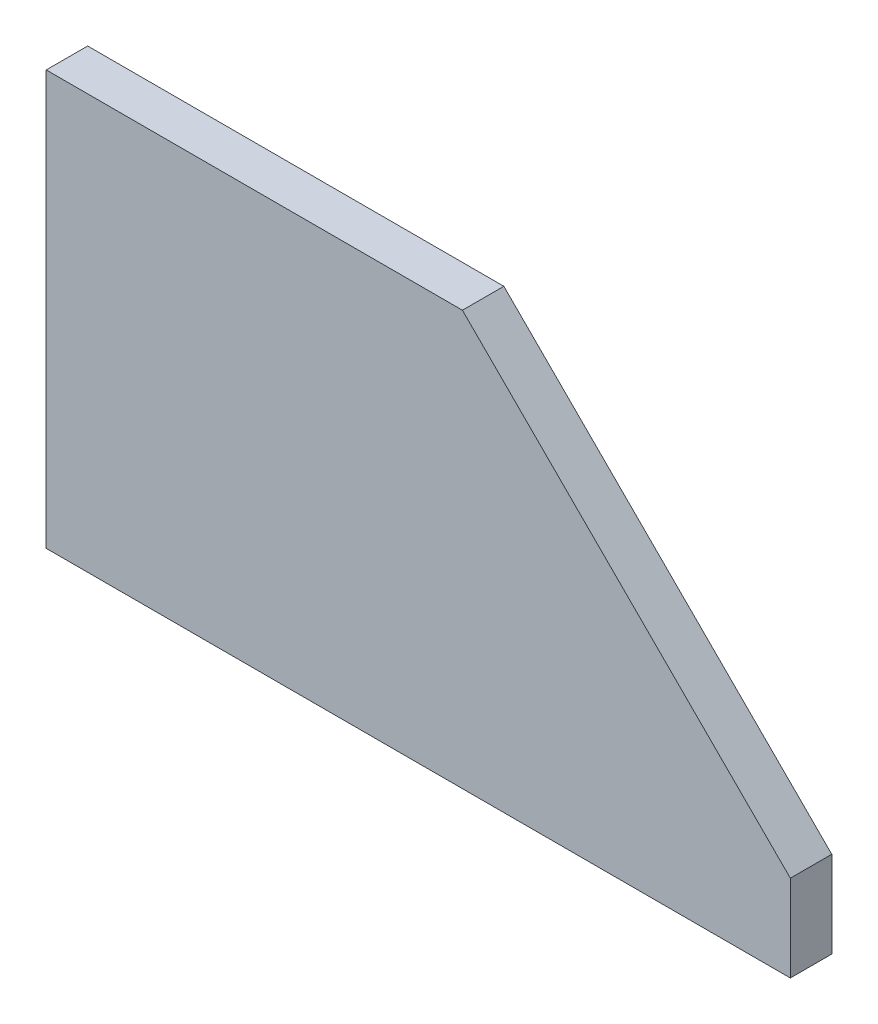
ISO-10303-21;
HEADER;
FILE_DESCRIPTION(('STEP AP214'),'2;1');
FILE_NAME('part.step','',(''),(''),'','','');
FILE_SCHEMA(('AUTOMOTIVE_DESIGN { 1 0 10303 214 1 1 1 1 }'));
ENDSEC;
DATA;
#1=APPLICATION_CONTEXT('core data for automotive mechanical design processes');
#2=APPLICATION_PROTOCOL_DEFINITION('international standard','automotive_design',2000,#1);
#3=PRODUCT_CONTEXT('',#1,'mechanical');
#4=PRODUCT('Part','Part','',(#3));
#5=PRODUCT_RELATED_PRODUCT_CATEGORY('part','',(#4));
#6=PRODUCT_DEFINITION_FORMATION('','',#4);
#7=PRODUCT_DEFINITION_CONTEXT('part definition',#1,'design');
#8=PRODUCT_DEFINITION('design','',#6,#7);
#9=PRODUCT_DEFINITION_SHAPE('','',#8);
#10=(LENGTH_UNIT() NAMED_UNIT(*) SI_UNIT(.MILLI.,.METRE.));
#11=(NAMED_UNIT(*) PLANE_ANGLE_UNIT() SI_UNIT($,.RADIAN.));
#12=(NAMED_UNIT(*) SI_UNIT($,.STERADIAN.) SOLID_ANGLE_UNIT());
#13=UNCERTAINTY_MEASURE_WITH_UNIT(LENGTH_MEASURE(1.E-05),#10,'distance_accuracy_value','');
#14=(GEOMETRIC_REPRESENTATION_CONTEXT(3) GLOBAL_UNCERTAINTY_ASSIGNED_CONTEXT((#13)) GLOBAL_UNIT_ASSIGNED_CONTEXT((#10,
#11,#12)) REPRESENTATION_CONTEXT('',''));
#15=CARTESIAN_POINT('',(0.,0.,0.));
#16=DIRECTION('',(0.,0.,1.));
#17=DIRECTION('',(1.,0.,0.));
#18=AXIS2_PLACEMENT_3D('',#15,#16,#17);
#19=CARTESIAN_POINT('',(0.,0.,12.));
#20=DIRECTION('',(1.,0.,0.));
#21=DIRECTION('',(0.,0.,-1.));
#22=AXIS2_PLACEMENT_3D('',#19,#20,#21);
#23=PLANE('',#22);
#24=DIRECTION('',(0.,-1.00000000000001,0.));
#25=VECTOR('',#24,1.);
#26=CARTESIAN_POINT('',(0.,0.,0.));
#27=LINE('',#26,#25);
#28=CARTESIAN_POINT('',(-4.44089209850063E-13,120.000000000001,1.77635683940025E-12));
#29=VERTEX_POINT('',#28);
#30=CARTESIAN_POINT('',(0.,0.,0.));
#31=VERTEX_POINT('',#30);
#32=EDGE_CURVE('E84',#29,#31,#27,.T.);
#33=ORIENTED_EDGE('',*,*,#32,.T.);
#34=DIRECTION('',(0.,0.,-1.));
#35=VECTOR('',#34,1.);
#36=CARTESIAN_POINT('',(0.,0.,12.));
#37=LINE('',#36,#35);
#38=CARTESIAN_POINT('',(0.,0.,12.));
#39=VERTEX_POINT('',#38);
#40=EDGE_CURVE('E11',#39,#31,#37,.T.);
#41=ORIENTED_EDGE('',*,*,#40,.F.);
#42=DIRECTION('',(0.,-1.00000000000001,0.));
#43=VECTOR('',#42,1.);
#44=CARTESIAN_POINT('',(0.,0.,12.));
#45=LINE('',#44,#43);
#46=CARTESIAN_POINT('',(-4.44089209850063E-13,120.000000000001,12.0000000000018));
#47=VERTEX_POINT('',#46);
#48=EDGE_CURVE('E105',#47,#39,#45,.T.);
#49=ORIENTED_EDGE('',*,*,#48,.F.);
#50=DIRECTION('',(0.,0.,-1.));
#51=VECTOR('',#50,1.);
#52=CARTESIAN_POINT('',(-4.44089209850063E-13,120.000000000001,12.0000000000018));
#53=LINE('',#52,#51);
#54=EDGE_CURVE('E97',#47,#29,#53,.T.);
#55=ORIENTED_EDGE('',*,*,#54,.T.);
#56=EDGE_LOOP('',(#33,#41,#49,#55));
#57=FACE_BOUND('',#56,.T.);
#58=ADVANCED_FACE('F34',(#57),#23,.F.);
#59=CARTESIAN_POINT('',(0.,0.,12.));
#60=DIRECTION('',(0.,1.00000000000001,0.));
#61=DIRECTION('',(0.,0.,1.));
#62=AXIS2_PLACEMENT_3D('',#59,#60,#61);
#63=PLANE('',#62);
#64=DIRECTION('',(1.,0.,0.));
#65=VECTOR('',#64,1.);
#66=CARTESIAN_POINT('',(0.,0.,0.));
#67=LINE('',#66,#65);
#68=CARTESIAN_POINT('',(215.5,0.,3.5527136788005E-12));
#69=VERTEX_POINT('',#68);
#70=EDGE_CURVE('E80',#31,#69,#67,.T.);
#71=ORIENTED_EDGE('',*,*,#70,.T.);
#72=DIRECTION('',(0.,0.,-1.));
#73=VECTOR('',#72,1.);
#74=CARTESIAN_POINT('',(215.5,0.,12.0000000000033));
#75=LINE('',#74,#73);
#76=CARTESIAN_POINT('',(215.5,0.,12.0000000000033));
#77=VERTEX_POINT('',#76);
#78=EDGE_CURVE('E41',#77,#69,#75,.T.);
#79=ORIENTED_EDGE('',*,*,#78,.F.);
#80=DIRECTION('',(1.,0.,0.));
#81=VECTOR('',#80,1.);
#82=CARTESIAN_POINT('',(0.,0.,12.));
#83=LINE('',#82,#81);
#84=EDGE_CURVE('E93',#39,#77,#83,.T.);
#85=ORIENTED_EDGE('',*,*,#84,.F.);
#86=ORIENTED_EDGE('',*,*,#40,.T.);
#87=EDGE_LOOP('',(#71,#79,#85,#86));
#88=FACE_BOUND('',#87,.T.);
#89=ADVANCED_FACE('F92',(#88),#63,.F.);
#90=CARTESIAN_POINT('',(215.5,0.,12.0000000000033));
#91=DIRECTION('',(-1.,0.,0.));
#92=DIRECTION('',(0.,-1.00000000000001,0.));
#93=AXIS2_PLACEMENT_3D('',#90,#91,#92);
#94=PLANE('',#93);
#95=DIRECTION('',(0.,1.00000000000001,0.));
#96=VECTOR('',#95,1.);
#97=CARTESIAN_POINT('',(215.5,0.,3.5527136788005E-12));
#98=LINE('',#97,#96);
#99=CARTESIAN_POINT('',(215.5,25.0300000000006,3.5527136788005E-12));
#100=VERTEX_POINT('',#99);
#101=EDGE_CURVE('E86',#69,#100,#98,.T.);
#102=ORIENTED_EDGE('',*,*,#101,.T.);
#103=DIRECTION('',(0.,0.,-1.));
#104=VECTOR('',#103,1.);
#105=CARTESIAN_POINT('',(215.5,25.0300000000006,12.0000000000033));
#106=LINE('',#105,#104);
#107=CARTESIAN_POINT('',(215.5,25.0300000000006,12.0000000000033));
#108=VERTEX_POINT('',#107);
#109=EDGE_CURVE('E116',#108,#100,#106,.T.);
#110=ORIENTED_EDGE('',*,*,#109,.F.);
#111=DIRECTION('',(0.,1.00000000000001,0.));
#112=VECTOR('',#111,1.);
#113=CARTESIAN_POINT('',(215.5,0.,12.0000000000033));
#114=LINE('',#113,#112);
#115=EDGE_CURVE('E108',#77,#108,#114,.T.);
#116=ORIENTED_EDGE('',*,*,#115,.F.);
#117=ORIENTED_EDGE('',*,*,#78,.T.);
#118=EDGE_LOOP('',(#102,#110,#116,#117));
#119=FACE_BOUND('',#118,.T.);
#120=ADVANCED_FACE('F120',(#119),#94,.F.);
#121=CARTESIAN_POINT('',(120.53,120.000000000001,11.9999999999965));
#122=DIRECTION('',(-0.70710678118655,-0.707106781186552,0.));
#123=DIRECTION('',(0.707106781186545,-0.707106781186551,0.));
#124=AXIS2_PLACEMENT_3D('',#121,#122,#123);
#125=PLANE('',#124);
#126=DIRECTION('',(-0.707106781186545,0.707106781186551,0.));
#127=VECTOR('',#126,1.);
#128=CARTESIAN_POINT('',(120.53,120.000000000001,-3.5527136788005E-12));
#129=LINE('',#128,#127);
#130=CARTESIAN_POINT('',(120.53,120.000000000001,-3.5527136788005E-12));
#131=VERTEX_POINT('',#130);
#132=EDGE_CURVE('E101',#100,#131,#129,.T.);
#133=ORIENTED_EDGE('',*,*,#132,.T.);
#134=DIRECTION('',(0.,0.,-1.));
#135=VECTOR('',#134,1.);
#136=CARTESIAN_POINT('',(120.53,120.000000000001,11.9999999999965));
#137=LINE('',#136,#135);
#138=CARTESIAN_POINT('',(120.53,120.000000000001,11.9999999999965));
#139=VERTEX_POINT('',#138);
#140=EDGE_CURVE('E113',#139,#131,#137,.T.);
#141=ORIENTED_EDGE('',*,*,#140,.F.);
#142=DIRECTION('',(-0.707106781186545,0.707106781186551,0.));
#143=VECTOR('',#142,1.);
#144=CARTESIAN_POINT('',(120.53,120.000000000001,11.9999999999965));
#145=LINE('',#144,#143);
#146=EDGE_CURVE('E53',#108,#139,#145,.T.);
#147=ORIENTED_EDGE('',*,*,#146,.F.);
#148=ORIENTED_EDGE('',*,*,#109,.T.);
#149=EDGE_LOOP('',(#133,#141,#147,#148));
#150=FACE_BOUND('',#149,.T.);
#151=ADVANCED_FACE('F131',(#150),#125,.F.);
#152=CARTESIAN_POINT('',(-4.44089209850063E-13,120.000000000001,12.0000000000018));
#153=DIRECTION('',(0.,-1.00000000000001,0.));
#154=DIRECTION('',(0.,0.,-1.));
#155=AXIS2_PLACEMENT_3D('',#152,#153,#154);
#156=PLANE('',#155);
#157=DIRECTION('',(-1.,0.,0.));
#158=VECTOR('',#157,1.);
#159=CARTESIAN_POINT('',(-4.44089209850063E-13,120.000000000001,1.77635683940025E-12));
#160=LINE('',#159,#158);
#161=EDGE_CURVE('E103',#131,#29,#160,.T.);
#162=ORIENTED_EDGE('',*,*,#161,.T.);
#163=ORIENTED_EDGE('',*,*,#54,.F.);
#164=DIRECTION('',(-1.,0.,0.));
#165=VECTOR('',#164,1.);
#166=CARTESIAN_POINT('',(-4.44089209850063E-13,120.000000000001,12.0000000000018));
#167=LINE('',#166,#165);
#168=EDGE_CURVE('E48',#139,#47,#167,.T.);
#169=ORIENTED_EDGE('',*,*,#168,.F.);
#170=ORIENTED_EDGE('',*,*,#140,.T.);
#171=EDGE_LOOP('',(#162,#163,#169,#170));
#172=FACE_BOUND('',#171,.T.);
#173=ADVANCED_FACE('F124',(#172),#156,.F.);
#174=CARTESIAN_POINT('',(-4.44089209850063E-13,120.000000000001,12.0000000000018));
#175=DIRECTION('',(0.,0.,-1.));
#176=DIRECTION('',(-1.,0.,0.));
#177=AXIS2_PLACEMENT_3D('',#174,#175,#176);
#178=PLANE('',#177);
#179=ORIENTED_EDGE('',*,*,#48,.T.);
#180=ORIENTED_EDGE('',*,*,#84,.T.);
#181=ORIENTED_EDGE('',*,*,#115,.T.);
#182=ORIENTED_EDGE('',*,*,#146,.T.);
#183=ORIENTED_EDGE('',*,*,#168,.T.);
#184=EDGE_LOOP('',(#179,#180,#181,#182,#183));
#185=FACE_BOUND('',#184,.T.);
#186=ADVANCED_FACE('F122',(#185),#178,.F.);
#187=CARTESIAN_POINT('',(-4.44089209850063E-13,120.000000000001,1.77635683940025E-12));
#188=DIRECTION('',(0.,0.,-1.));
#189=DIRECTION('',(-1.,0.,0.));
#190=AXIS2_PLACEMENT_3D('',#187,#188,#189);
#191=PLANE('',#190);
#192=ORIENTED_EDGE('',*,*,#32,.F.);
#193=ORIENTED_EDGE('',*,*,#161,.F.);
#194=ORIENTED_EDGE('',*,*,#132,.F.);
#195=ORIENTED_EDGE('',*,*,#101,.F.);
#196=ORIENTED_EDGE('',*,*,#70,.F.);
#197=EDGE_LOOP('',(#192,#193,#194,#195,#196));
#198=FACE_BOUND('',#197,.T.);
#199=ADVANCED_FACE('F81',(#198),#191,.T.);
#200=CLOSED_SHELL('',(#58,#89,#120,#151,#173,#186,#199));
#201=MANIFOLD_SOLID_BREP('B2',#200);
#202=ADVANCED_BREP_SHAPE_REPRESENTATION('',(#18,#201),#14);
#203=SHAPE_DEFINITION_REPRESENTATION(#9,#202);
ENDSEC;
END-ISO-10303-21;
